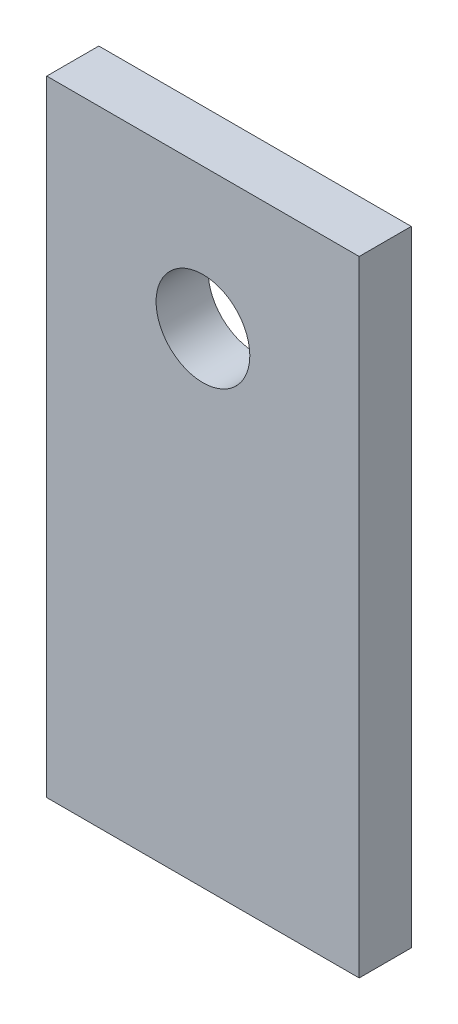
ISO-10303-21;
HEADER;
FILE_DESCRIPTION(('STEP AP214'),'2;1');
FILE_NAME('part.step','',(''),(''),'','','');
FILE_SCHEMA(('AUTOMOTIVE_DESIGN { 1 0 10303 214 1 1 1 1 }'));
ENDSEC;
DATA;
#1=APPLICATION_CONTEXT('core data for automotive mechanical design processes');
#2=APPLICATION_PROTOCOL_DEFINITION('international standard','automotive_design',2000,#1);
#3=PRODUCT_CONTEXT('',#1,'mechanical');
#4=PRODUCT('Part','Part','',(#3));
#5=PRODUCT_RELATED_PRODUCT_CATEGORY('part','',(#4));
#6=PRODUCT_DEFINITION_FORMATION('','',#4);
#7=PRODUCT_DEFINITION_CONTEXT('part definition',#1,'design');
#8=PRODUCT_DEFINITION('design','',#6,#7);
#9=PRODUCT_DEFINITION_SHAPE('','',#8);
#10=(LENGTH_UNIT() NAMED_UNIT(*) SI_UNIT(.MILLI.,.METRE.));
#11=(NAMED_UNIT(*) PLANE_ANGLE_UNIT() SI_UNIT($,.RADIAN.));
#12=(NAMED_UNIT(*) SI_UNIT($,.STERADIAN.) SOLID_ANGLE_UNIT());
#13=UNCERTAINTY_MEASURE_WITH_UNIT(LENGTH_MEASURE(1.E-05),#10,'distance_accuracy_value','');
#14=(GEOMETRIC_REPRESENTATION_CONTEXT(3) GLOBAL_UNCERTAINTY_ASSIGNED_CONTEXT((#13)) GLOBAL_UNIT_ASSIGNED_CONTEXT((#10,
#11,#12)) REPRESENTATION_CONTEXT('',''));
#15=CARTESIAN_POINT('',(0.,0.,0.));
#16=DIRECTION('',(0.,0.,1.));
#17=DIRECTION('',(1.,0.,0.));
#18=AXIS2_PLACEMENT_3D('',#15,#16,#17);
#19=CARTESIAN_POINT('',(0.,0.,5.));
#20=DIRECTION('',(0.,0.,-1.));
#21=DIRECTION('',(-1.,0.,0.));
#22=AXIS2_PLACEMENT_3D('',#19,#20,#21);
#23=PLANE('',#22);
#24=DIRECTION('',(0.,-1.,0.));
#25=VECTOR('',#24,1.);
#26=CARTESIAN_POINT('',(0.,0.,5.));
#27=LINE('',#26,#25);
#28=CARTESIAN_POINT('',(0.,60.,5.));
#29=VERTEX_POINT('',#28);
#30=CARTESIAN_POINT('',(0.,0.,5.));
#31=VERTEX_POINT('',#30);
#32=EDGE_CURVE('E96',#29,#31,#27,.T.);
#33=ORIENTED_EDGE('',*,*,#32,.T.);
#34=DIRECTION('',(1.,0.,0.));
#35=VECTOR('',#34,1.);
#36=CARTESIAN_POINT('',(0.,0.,5.));
#37=LINE('',#36,#35);
#38=CARTESIAN_POINT('',(30.,0.,5.));
#39=VERTEX_POINT('',#38);
#40=EDGE_CURVE('E91',#31,#39,#37,.T.);
#41=ORIENTED_EDGE('',*,*,#40,.T.);
#42=DIRECTION('',(0.,1.,0.));
#43=VECTOR('',#42,1.);
#44=CARTESIAN_POINT('',(30.,0.,5.));
#45=LINE('',#44,#43);
#46=CARTESIAN_POINT('',(30.,60.,5.));
#47=VERTEX_POINT('',#46);
#48=EDGE_CURVE('E94',#39,#47,#45,.T.);
#49=ORIENTED_EDGE('',*,*,#48,.T.);
#50=DIRECTION('',(-1.,0.,0.));
#51=VECTOR('',#50,1.);
#52=CARTESIAN_POINT('',(0.,60.,5.));
#53=LINE('',#52,#51);
#54=EDGE_CURVE('E61',#47,#29,#53,.T.);
#55=ORIENTED_EDGE('',*,*,#54,.T.);
#56=EDGE_LOOP('',(#33,#41,#49,#55));
#57=FACE_BOUND('',#56,.T.);
#58=CARTESIAN_POINT('',(15.,46.5,5.));
#59=DIRECTION('',(0.,0.,1.));
#60=DIRECTION('',(1.,0.,0.));
#61=AXIS2_PLACEMENT_3D('',#58,#59,#60);
#62=CIRCLE('',#61,4.50000000000001);
#63=CARTESIAN_POINT('',(19.5,46.5,5.));
#64=VERTEX_POINT('',#63);
#65=EDGE_CURVE('E116',#64,#64,#62,.T.);
#66=ORIENTED_EDGE('',*,*,#65,.F.);
#67=EDGE_LOOP('',(#66));
#68=FACE_BOUND('',#67,.T.);
#69=ADVANCED_FACE('F43',(#57,#68),#23,.F.);
#70=CARTESIAN_POINT('',(0.,0.,0.));
#71=DIRECTION('',(0.,0.,-1.));
#72=DIRECTION('',(-1.,0.,0.));
#73=AXIS2_PLACEMENT_3D('',#70,#71,#72);
#74=PLANE('',#73);
#75=DIRECTION('',(0.,-1.,0.));
#76=VECTOR('',#75,1.);
#77=CARTESIAN_POINT('',(0.,0.,0.));
#78=LINE('',#77,#76);
#79=CARTESIAN_POINT('',(0.,60.,0.));
#80=VERTEX_POINT('',#79);
#81=CARTESIAN_POINT('',(0.,0.,0.));
#82=VERTEX_POINT('',#81);
#83=EDGE_CURVE('E112',#80,#82,#78,.T.);
#84=ORIENTED_EDGE('',*,*,#83,.F.);
#85=DIRECTION('',(-1.,0.,0.));
#86=VECTOR('',#85,1.);
#87=CARTESIAN_POINT('',(0.,60.,0.));
#88=LINE('',#87,#86);
#89=CARTESIAN_POINT('',(30.,60.,0.));
#90=VERTEX_POINT('',#89);
#91=EDGE_CURVE('E84',#90,#80,#88,.T.);
#92=ORIENTED_EDGE('',*,*,#91,.F.);
#93=DIRECTION('',(0.,1.,0.));
#94=VECTOR('',#93,1.);
#95=CARTESIAN_POINT('',(30.,0.,0.));
#96=LINE('',#95,#94);
#97=CARTESIAN_POINT('',(30.,0.,0.));
#98=VERTEX_POINT('',#97);
#99=EDGE_CURVE('E78',#98,#90,#96,.T.);
#100=ORIENTED_EDGE('',*,*,#99,.F.);
#101=DIRECTION('',(1.,0.,0.));
#102=VECTOR('',#101,1.);
#103=CARTESIAN_POINT('',(0.,0.,0.));
#104=LINE('',#103,#102);
#105=EDGE_CURVE('E101',#82,#98,#104,.T.);
#106=ORIENTED_EDGE('',*,*,#105,.F.);
#107=EDGE_LOOP('',(#84,#92,#100,#106));
#108=FACE_BOUND('',#107,.T.);
#109=CARTESIAN_POINT('',(15.,46.5,0.));
#110=DIRECTION('',(0.,0.,1.));
#111=DIRECTION('',(1.,0.,0.));
#112=AXIS2_PLACEMENT_3D('',#109,#110,#111);
#113=CIRCLE('',#112,4.50000000000001);
#114=CARTESIAN_POINT('',(19.5,46.5,0.));
#115=VERTEX_POINT('',#114);
#116=EDGE_CURVE('E134',#115,#115,#113,.T.);
#117=ORIENTED_EDGE('',*,*,#116,.T.);
#118=EDGE_LOOP('',(#117));
#119=FACE_BOUND('',#118,.T.);
#120=ADVANCED_FACE('F129',(#108,#119),#74,.T.);
#121=CARTESIAN_POINT('',(0.,0.,5.));
#122=DIRECTION('',(1.,0.,0.));
#123=DIRECTION('',(0.,0.,-1.));
#124=AXIS2_PLACEMENT_3D('',#121,#122,#123);
#125=PLANE('',#124);
#126=ORIENTED_EDGE('',*,*,#83,.T.);
#127=DIRECTION('',(0.,0.,-1.));
#128=VECTOR('',#127,1.);
#129=CARTESIAN_POINT('',(0.,0.,5.));
#130=LINE('',#129,#128);
#131=EDGE_CURVE('E11',#31,#82,#130,.T.);
#132=ORIENTED_EDGE('',*,*,#131,.F.);
#133=ORIENTED_EDGE('',*,*,#32,.F.);
#134=DIRECTION('',(0.,0.,-1.));
#135=VECTOR('',#134,1.);
#136=CARTESIAN_POINT('',(0.,60.,5.));
#137=LINE('',#136,#135);
#138=EDGE_CURVE('E108',#29,#80,#137,.T.);
#139=ORIENTED_EDGE('',*,*,#138,.T.);
#140=EDGE_LOOP('',(#126,#132,#133,#139));
#141=FACE_BOUND('',#140,.T.);
#142=ADVANCED_FACE('F45',(#141),#125,.F.);
#143=CARTESIAN_POINT('',(0.,0.,5.));
#144=DIRECTION('',(0.,1.,0.));
#145=DIRECTION('',(0.,0.,1.));
#146=AXIS2_PLACEMENT_3D('',#143,#144,#145);
#147=PLANE('',#146);
#148=ORIENTED_EDGE('',*,*,#105,.T.);
#149=DIRECTION('',(0.,0.,-1.));
#150=VECTOR('',#149,1.);
#151=CARTESIAN_POINT('',(30.,0.,5.));
#152=LINE('',#151,#150);
#153=EDGE_CURVE('E53',#39,#98,#152,.T.);
#154=ORIENTED_EDGE('',*,*,#153,.F.);
#155=ORIENTED_EDGE('',*,*,#40,.F.);
#156=ORIENTED_EDGE('',*,*,#131,.T.);
#157=EDGE_LOOP('',(#148,#154,#155,#156));
#158=FACE_BOUND('',#157,.T.);
#159=ADVANCED_FACE('F100',(#158),#147,.F.);
#160=CARTESIAN_POINT('',(30.,0.,5.));
#161=DIRECTION('',(-1.,0.,0.));
#162=DIRECTION('',(0.,0.,1.));
#163=AXIS2_PLACEMENT_3D('',#160,#161,#162);
#164=PLANE('',#163);
#165=ORIENTED_EDGE('',*,*,#99,.T.);
#166=DIRECTION('',(0.,0.,-1.));
#167=VECTOR('',#166,1.);
#168=CARTESIAN_POINT('',(30.,60.,5.));
#169=LINE('',#168,#167);
#170=EDGE_CURVE('E103',#47,#90,#169,.T.);
#171=ORIENTED_EDGE('',*,*,#170,.F.);
#172=ORIENTED_EDGE('',*,*,#48,.F.);
#173=ORIENTED_EDGE('',*,*,#153,.T.);
#174=EDGE_LOOP('',(#165,#171,#172,#173));
#175=FACE_BOUND('',#174,.T.);
#176=ADVANCED_FACE('F104',(#175),#164,.F.);
#177=CARTESIAN_POINT('',(0.,60.,5.));
#178=DIRECTION('',(0.,-1.,0.));
#179=DIRECTION('',(0.,0.,-1.));
#180=AXIS2_PLACEMENT_3D('',#177,#178,#179);
#181=PLANE('',#180);
#182=ORIENTED_EDGE('',*,*,#91,.T.);
#183=ORIENTED_EDGE('',*,*,#138,.F.);
#184=ORIENTED_EDGE('',*,*,#54,.F.);
#185=ORIENTED_EDGE('',*,*,#170,.T.);
#186=EDGE_LOOP('',(#182,#183,#184,#185));
#187=FACE_BOUND('',#186,.T.);
#188=ADVANCED_FACE('F126',(#187),#181,.F.);
#189=CARTESIAN_POINT('',(15.,46.5,5.));
#190=DIRECTION('',(0.,0.,-1.));
#191=DIRECTION('',(-1.,0.,0.));
#192=AXIS2_PLACEMENT_3D('',#189,#190,#191);
#193=CYLINDRICAL_SURFACE('',#192,4.50000000000001);
#194=ORIENTED_EDGE('',*,*,#65,.T.);
#195=EDGE_LOOP('',(#194));
#196=FACE_BOUND('',#195,.T.);
#197=ORIENTED_EDGE('',*,*,#116,.F.);
#198=EDGE_LOOP('',(#197));
#199=FACE_BOUND('',#198,.T.);
#200=ADVANCED_FACE('F142',(#196,#199),#193,.F.);
#201=CLOSED_SHELL('',(#69,#120,#142,#159,#176,#188,#200));
#202=MANIFOLD_SOLID_BREP('B2',#201);
#203=ADVANCED_BREP_SHAPE_REPRESENTATION('',(#18,#202),#14);
#204=SHAPE_DEFINITION_REPRESENTATION(#9,#203);
ENDSEC;
END-ISO-10303-21;
